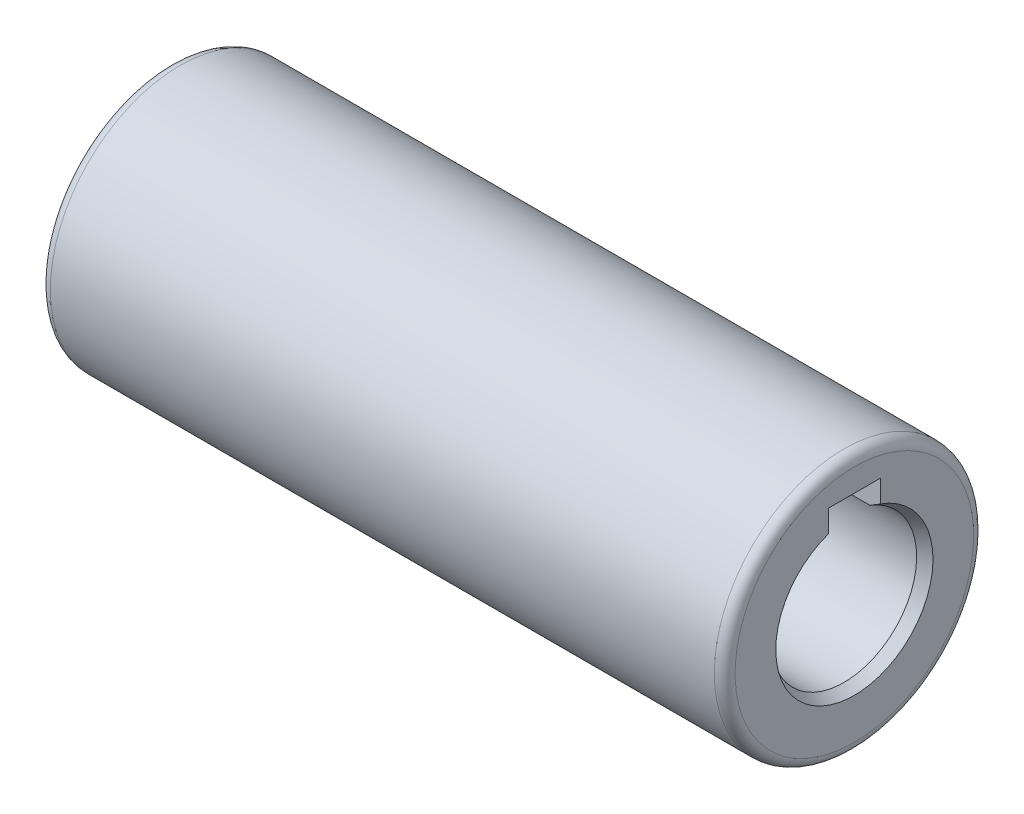
ISO-10303-21;
HEADER;
FILE_DESCRIPTION(('STEP AP214'),'2;1');
FILE_NAME('part.step','',(''),(''),'','','');
FILE_SCHEMA(('AUTOMOTIVE_DESIGN { 1 0 10303 214 1 1 1 1 }'));
ENDSEC;
DATA;
#1=APPLICATION_CONTEXT('core data for automotive mechanical design processes');
#2=APPLICATION_PROTOCOL_DEFINITION('international standard','automotive_design',2000,#1);
#3=PRODUCT_CONTEXT('',#1,'mechanical');
#4=PRODUCT('Part','Part','',(#3));
#5=PRODUCT_RELATED_PRODUCT_CATEGORY('part','',(#4));
#6=PRODUCT_DEFINITION_FORMATION('','',#4);
#7=PRODUCT_DEFINITION_CONTEXT('part definition',#1,'design');
#8=PRODUCT_DEFINITION('design','',#6,#7);
#9=PRODUCT_DEFINITION_SHAPE('','',#8);
#10=(LENGTH_UNIT() NAMED_UNIT(*) SI_UNIT(.MILLI.,.METRE.));
#11=(NAMED_UNIT(*) PLANE_ANGLE_UNIT() SI_UNIT($,.RADIAN.));
#12=(NAMED_UNIT(*) SI_UNIT($,.STERADIAN.) SOLID_ANGLE_UNIT());
#13=UNCERTAINTY_MEASURE_WITH_UNIT(LENGTH_MEASURE(1.E-05),#10,'distance_accuracy_value','');
#14=(GEOMETRIC_REPRESENTATION_CONTEXT(3) GLOBAL_UNCERTAINTY_ASSIGNED_CONTEXT((#13)) GLOBAL_UNIT_ASSIGNED_CONTEXT((#10,
#11,#12)) REPRESENTATION_CONTEXT('',''));
#15=CARTESIAN_POINT('',(0.,0.,0.));
#16=DIRECTION('',(0.,0.,1.));
#17=DIRECTION('',(1.,0.,0.));
#18=AXIS2_PLACEMENT_3D('',#15,#16,#17);
#19=CARTESIAN_POINT('',(-33.,0.,0.));
#20=DIRECTION('',(-1.,0.,0.));
#21=DIRECTION('',(0.,-1.,0.));
#22=AXIS2_PLACEMENT_3D('',#19,#20,#21);
#23=CYLINDRICAL_SURFACE('',#22,7.);
#24=CARTESIAN_POINT('',(7.5,0.,0.));
#25=DIRECTION('',(-1.,0.,0.));
#26=DIRECTION('',(0.,-1.,0.));
#27=AXIS2_PLACEMENT_3D('',#24,#25,#26);
#28=CIRCLE('',#27,7.);
#29=CARTESIAN_POINT('',(7.5,6.53834841531101,-2.5));
#30=VERTEX_POINT('',#29);
#31=CARTESIAN_POINT('',(7.5,6.53834841531101,2.5));
#32=VERTEX_POINT('',#31);
#33=EDGE_CURVE('E224',#30,#32,#28,.T.);
#34=ORIENTED_EDGE('',*,*,#33,.T.);
#35=DIRECTION('',(-1.,0.,0.));
#36=VECTOR('',#35,1.);
#37=CARTESIAN_POINT('',(-33.,6.53834841531101,2.5));
#38=LINE('',#37,#36);
#39=CARTESIAN_POINT('',(32.,6.53834841531102,2.5));
#40=VERTEX_POINT('',#39);
#41=EDGE_CURVE('E178',#32,#40,#38,.F.);
#42=ORIENTED_EDGE('',*,*,#41,.T.);
#43=CARTESIAN_POINT('',(32.,0.,0.));
#44=DIRECTION('',(-1.,0.,0.));
#45=DIRECTION('',(0.,-1.,0.));
#46=AXIS2_PLACEMENT_3D('',#43,#44,#45);
#47=CIRCLE('',#46,7.);
#48=CARTESIAN_POINT('',(32.,6.53834841531102,-2.5));
#49=VERTEX_POINT('',#48);
#50=EDGE_CURVE('E245',#40,#49,#47,.F.);
#51=ORIENTED_EDGE('',*,*,#50,.T.);
#52=DIRECTION('',(-1.,0.,0.));
#53=VECTOR('',#52,1.);
#54=CARTESIAN_POINT('',(-33.,6.53834841531101,-2.5));
#55=LINE('',#54,#53);
#56=EDGE_CURVE('E46',#49,#30,#55,.T.);
#57=ORIENTED_EDGE('',*,*,#56,.T.);
#58=EDGE_LOOP('',(#34,#42,#51,#57));
#59=FACE_BOUND('',#58,.T.);
#60=ADVANCED_FACE('F17',(#59),#23,.F.);
#61=CARTESIAN_POINT('',(4.,0.,0.));
#62=DIRECTION('',(-1.,0.,0.));
#63=DIRECTION('',(0.,-1.,0.));
#64=AXIS2_PLACEMENT_3D('',#61,#62,#63);
#65=CONICAL_SURFACE('',#64,10.5,0.785398163397448);
#66=CARTESIAN_POINT('',(3.46163000243048,9.3,-5.94605854354318));
#67=CARTESIAN_POINT('',(3.54685120634403,9.3,-5.78783362329451));
#68=CARTESIAN_POINT('',(3.63022221766871,9.30000000000001,-5.62859718548707));
#69=CARTESIAN_POINT('',(3.7927083936606,9.30000000000001,-5.30803499150762));
#70=CARTESIAN_POINT('',(3.87182492851184,9.30000000000001,-5.14670992901251));
#71=CARTESIAN_POINT('',(4.02558275946007,9.30000000000001,-4.82120873302001));
#72=CARTESIAN_POINT('',(4.10020666279463,9.30000000000001,-4.65702434100527));
#73=CARTESIAN_POINT('',(4.24407597855057,9.30000000000001,-4.326218926683));
#74=CARTESIAN_POINT('',(4.31331851061846,9.30000000000001,-4.1595966554366));
#75=CARTESIAN_POINT('',(4.51321496536946,9.30000000000001,-3.65279891292511));
#76=CARTESIAN_POINT('',(4.63452110300595,9.30000000000001,-3.30884355687202));
#77=CARTESIAN_POINT('',(4.84597044842199,9.3,-2.61156273327106));
#78=CARTESIAN_POINT('',(4.93613791014679,9.3,-2.25824479028153));
#79=CARTESIAN_POINT('',(5.05397250067452,9.3,-1.66998525222829));
#80=CARTESIAN_POINT('',(5.09246729373263,9.3,-1.43719717309367));
#81=CARTESIAN_POINT('',(5.15248858293873,9.30000000000001,-0.969393789805004));
#82=CARTESIAN_POINT('',(5.17401420484636,9.30000000000001,-0.734378371531098));
#83=CARTESIAN_POINT('',(5.19915444556598,9.30000000000001,-0.265045907994946));
#84=CARTESIAN_POINT('',(5.202894275992,9.30000000000001,-0.0307356213817093));
#85=CARTESIAN_POINT('',(5.19265855297041,9.3,0.437496657778366));
#86=CARTESIAN_POINT('',(5.17868249325451,9.3,0.671418639037289));
#87=CARTESIAN_POINT('',(5.13040380997504,9.3,1.17012886665844));
#88=CARTESIAN_POINT('',(5.09353656300503,9.3,1.4346685867482));
#89=CARTESIAN_POINT('',(4.99920645475335,9.30000000000001,1.96008716742081));
#90=CARTESIAN_POINT('',(4.94173800486261,9.30000000000001,2.22096501465124));
#91=CARTESIAN_POINT('',(4.84147591244329,9.30000000000001,2.61018773385523));
#92=CARTESIAN_POINT('',(4.80546128972083,9.30000000000001,2.74032840084046));
#93=CARTESIAN_POINT('',(4.72910092706749,9.30000000000001,2.99929424331557));
#94=CARTESIAN_POINT('',(4.68875643198022,9.30000000000001,3.12811978530305));
#95=CARTESIAN_POINT('',(4.56171406657002,9.3,3.51255281376575));
#96=CARTESIAN_POINT('',(4.46899120980495,9.3,3.76617809687951));
#97=CARTESIAN_POINT('',(4.2226115131823,9.3,4.38754109106529));
#98=CARTESIAN_POINT('',(4.06096701828225,9.3,4.75209298387828));
#99=CARTESIAN_POINT('',(3.71501728910871,9.30000000000001,5.47037453660907));
#100=CARTESIAN_POINT('',(3.53069828568788,9.30000000000001,5.8240974561831));
#101=CARTESIAN_POINT('',(3.1440431200673,9.30000000000001,6.52325741646248));
#102=CARTESIAN_POINT('',(2.94164024728258,9.30000000000001,6.8686572626618));
#103=CARTESIAN_POINT('',(2.52349168194028,9.30000000000001,7.55112134634234));
#104=CARTESIAN_POINT('',(2.30774889633075,9.30000000000001,7.88818737762043));
#105=CARTESIAN_POINT('',(1.87732784217865,9.30000000000001,8.53802918293863));
#106=CARTESIAN_POINT('',(1.66317768157205,9.30000000000001,8.85115657629117));
#107=CARTESIAN_POINT('',(1.22736195761923,9.30000000000001,9.47215972682581));
#108=CARTESIAN_POINT('',(1.00569576703578,9.30000000000001,9.78003504246624));
#109=CARTESIAN_POINT('',(0.55836922060326,9.30000000000001,10.3885180025935));
#110=CARTESIAN_POINT('',(0.332764110091508,9.30000000000001,10.6891663985368));
#111=CARTESIAN_POINT('',(-0.123311726676725,9.30000000000001,11.2866301151147));
#112=CARTESIAN_POINT('',(-0.353781172022986,9.3,11.5834464124671));
#113=CARTESIAN_POINT('',(-0.586202909211337,9.3,11.8787001905889));
#114=B_SPLINE_CURVE_WITH_KNOTS('',3,(#66,#67,#68,#69,#70,#71,#72,#73,#74,#75,#76,#77,#78,#79,
#80,#81,#82,#83,#84,#85,#86,#87,#88,#89,#90,#91,#92,#93,#94,#95,#96,#97,#98,#99,#100,#101,#102,
#103,#104,#105,#106,#107,#108,#109,#110,#111,#112,#113),.UNSPECIFIED.,.F.,.F.,(4,2,2,2,2,2,2,2,
2,2,2,2,2,2,2,2,2,2,2,2,2,2,2,4),(0.,0.539153897346478,1.0781331034826,1.61908002222792,
2.16031451421384,3.2532519204881,4.34533610648292,5.05263433922266,5.75996900911444,
6.46231661126947,7.16468428491629,7.96507694739988,8.76568690160594,9.17071941196027,
9.5756357853459,10.3852784874463,11.5805521499964,12.7765552617353,13.9771685047727,
15.177521033697,16.3154499334511,17.4534740319536,18.5810653901236,19.708363438943),.UNSPECIFIED.);
#115=CARTESIAN_POINT('',(4.86983904599721,9.3,-2.5));
#116=VERTEX_POINT('',#115);
#117=CARTESIAN_POINT('',(4.86983904599721,9.3,2.5));
#118=VERTEX_POINT('',#117);
#119=EDGE_CURVE('E208',#116,#118,#114,.T.);
#120=ORIENTED_EDGE('',*,*,#119,.T.);
#121=CARTESIAN_POINT('',(1.39485028369227,12.8644840194561,2.5));
#122=CARTESIAN_POINT('',(1.64194981924903,12.6127582938976,2.5));
#123=CARTESIAN_POINT('',(1.88891869151697,12.360904211294,2.5));
#124=CARTESIAN_POINT('',(2.38253410736025,11.8568794750453,2.5));
#125=CARTESIAN_POINT('',(2.629180650331,11.6047088208082,2.5));
#126=CARTESIAN_POINT('',(3.36856629729448,10.8476106897931,2.5));
#127=CARTESIAN_POINT('',(3.86072894606619,10.3421199165439,2.5));
#128=CARTESIAN_POINT('',(4.84255203455589,9.32909770687162,2.5));
#129=CARTESIAN_POINT('',(5.33221338876389,8.82156715873817,2.5));
#130=CARTESIAN_POINT('',(6.06384909279959,8.05753833431255,2.5));
#131=CARTESIAN_POINT('',(6.30725074351754,7.80240747366521,2.5));
#132=CARTESIAN_POINT('',(6.79277961095316,7.29093658021132,2.5));
#133=CARTESIAN_POINT('',(7.03490683296757,7.03459655243869,2.5));
#134=CARTESIAN_POINT('',(7.47674185788069,6.56365896249445,2.5));
#135=CARTESIAN_POINT('',(7.67671700603354,6.34931246279199,2.5));
#136=CARTESIAN_POINT('',(8.07506980507555,5.91914924601433,2.5));
#137=CARTESIAN_POINT('',(8.27344749866287,5.70333256852188,2.5));
#138=CARTESIAN_POINT('',(8.66806681613347,5.26968329002073,2.5));
#139=CARTESIAN_POINT('',(8.86430807976641,5.05185036014247,2.5));
#140=CARTESIAN_POINT('',(9.1563594487669,4.72303074981693,2.5));
#141=CARTESIAN_POINT('',(9.25332894260962,4.61307439840474,2.5));
#142=CARTESIAN_POINT('',(9.44631845902583,4.39232751658852,2.5));
#143=CARTESIAN_POINT('',(9.54233845943368,4.28153696681624,2.5));
#144=CARTESIAN_POINT('',(9.63779326443298,4.1702583060757,2.5));
#145=B_SPLINE_CURVE_WITH_KNOTS('',3,(#121,#122,#123,#124,#125,#126,#127,#128,#129,#130,#131,
#132,#133,#134,#135,#136,#137,#138,#139,#140,#141,#142,#143,#144),.UNSPECIFIED.,.F.,.F.,(4,2,2,
2,2,2,2,2,2,2,2,4),(0.,1.0582137102719,2.11642940258514,4.23295698204211,6.34864562076016,
7.40648239678765,8.46431477277966,9.3437461932028,10.2231540288632,11.1027079246151,
11.5425227463704,11.9823478113402),.UNSPECIFIED.);
#146=EDGE_CURVE('E264',#118,#32,#145,.T.);
#147=ORIENTED_EDGE('',*,*,#146,.T.);
#148=ORIENTED_EDGE('',*,*,#33,.F.);
#149=CARTESIAN_POINT('',(9.63779326443298,4.1702583060757,-2.5));
#150=CARTESIAN_POINT('',(9.54233845943368,4.28153696681624,-2.5));
#151=CARTESIAN_POINT('',(9.44631845902583,4.39232751658852,-2.5));
#152=CARTESIAN_POINT('',(9.25332894260962,4.61307439840474,-2.5));
#153=CARTESIAN_POINT('',(9.1563594487669,4.72303074981693,-2.5));
#154=CARTESIAN_POINT('',(8.86430807976641,5.05185036014246,-2.5));
#155=CARTESIAN_POINT('',(8.66806681613348,5.26968329002073,-2.5));
#156=CARTESIAN_POINT('',(8.27344749866287,5.70333256852187,-2.5));
#157=CARTESIAN_POINT('',(8.07506980507555,5.91914924601433,-2.5));
#158=CARTESIAN_POINT('',(7.67671700603355,6.34931246279198,-2.5));
#159=CARTESIAN_POINT('',(7.4767418578807,6.56365896249445,-2.5));
#160=CARTESIAN_POINT('',(7.03490683296758,7.03459655243869,-2.5));
#161=CARTESIAN_POINT('',(6.79277961095316,7.29093658021132,-2.5));
#162=CARTESIAN_POINT('',(6.30725074351755,7.80240747366521,-2.5));
#163=CARTESIAN_POINT('',(6.06384909279959,8.05753833431255,-2.5));
#164=CARTESIAN_POINT('',(5.3322133887639,8.82156715873816,-2.5));
#165=CARTESIAN_POINT('',(4.84255203455589,9.32909770687162,-2.5));
#166=CARTESIAN_POINT('',(3.86072894606619,10.3421199165439,-2.5));
#167=CARTESIAN_POINT('',(3.36856629729449,10.8476106897931,-2.5));
#168=CARTESIAN_POINT('',(2.629180650331,11.6047088208082,-2.5));
#169=CARTESIAN_POINT('',(2.38253410736025,11.8568794750453,-2.5));
#170=CARTESIAN_POINT('',(1.88891869151697,12.360904211294,-2.5));
#171=CARTESIAN_POINT('',(1.64194981924903,12.6127582938976,-2.5));
#172=CARTESIAN_POINT('',(1.39485028369227,12.8644840194561,-2.5));
#173=B_SPLINE_CURVE_WITH_KNOTS('',3,(#149,#150,#151,#152,#153,#154,#155,#156,#157,#158,#159,
#160,#161,#162,#163,#164,#165,#166,#167,#168,#169,#170,#171,#172),.UNSPECIFIED.,.F.,.F.,(4,2,2,
2,2,2,2,2,2,2,2,4),(0.,0.439825064969736,0.879639886725099,1.75919378247692,2.63860161813736,
3.5180330385605,4.57586541455251,5.63370219058,7.74939082929805,9.86591840875502,
10.9241341010683,11.9823478113402),.UNSPECIFIED.);
#174=EDGE_CURVE('E135',#30,#116,#173,.T.);
#175=ORIENTED_EDGE('',*,*,#174,.T.);
#176=EDGE_LOOP('',(#120,#147,#148,#175));
#177=FACE_BOUND('',#176,.T.);
#178=CARTESIAN_POINT('',(4.,0.,0.));
#179=DIRECTION('',(-1.,0.,0.));
#180=DIRECTION('',(0.,-1.,0.));
#181=AXIS2_PLACEMENT_3D('',#178,#179,#180);
#182=CIRCLE('',#181,10.5);
#183=CARTESIAN_POINT('',(4.,-10.5,0.));
#184=VERTEX_POINT('',#183);
#185=EDGE_CURVE('E221',#184,#184,#182,.T.);
#186=ORIENTED_EDGE('',*,*,#185,.T.);
#187=EDGE_LOOP('',(#186));
#188=FACE_BOUND('',#187,.T.);
#189=ADVANCED_FACE('F150',(#177,#188),#65,.F.);
#190=CARTESIAN_POINT('',(-33.,0.,0.));
#191=DIRECTION('',(-1.,0.,0.));
#192=DIRECTION('',(0.,-1.,0.));
#193=AXIS2_PLACEMENT_3D('',#190,#191,#192);
#194=CYLINDRICAL_SURFACE('',#193,10.5);
#195=ORIENTED_EDGE('',*,*,#185,.F.);
#196=EDGE_LOOP('',(#195));
#197=FACE_BOUND('',#196,.T.);
#198=CARTESIAN_POINT('',(-4.,0.,0.));
#199=DIRECTION('',(-1.,0.,0.));
#200=DIRECTION('',(0.,-1.,0.));
#201=AXIS2_PLACEMENT_3D('',#198,#199,#200);
#202=CIRCLE('',#201,10.5);
#203=CARTESIAN_POINT('',(-4.,-10.5,0.));
#204=VERTEX_POINT('',#203);
#205=EDGE_CURVE('E218',#204,#204,#202,.T.);
#206=ORIENTED_EDGE('',*,*,#205,.T.);
#207=EDGE_LOOP('',(#206));
#208=FACE_BOUND('',#207,.T.);
#209=ADVANCED_FACE('F186',(#197,#208),#194,.F.);
#210=CARTESIAN_POINT('',(-7.5,0.,0.));
#211=DIRECTION('',(1.,0.,0.));
#212=DIRECTION('',(0.,1.,0.));
#213=AXIS2_PLACEMENT_3D('',#210,#211,#212);
#214=CONICAL_SURFACE('',#213,7.,0.785398163397448);
#215=ORIENTED_EDGE('',*,*,#205,.F.);
#216=EDGE_LOOP('',(#215));
#217=FACE_BOUND('',#216,.T.);
#218=CARTESIAN_POINT('',(-7.5,0.,0.));
#219=DIRECTION('',(-1.,0.,0.));
#220=DIRECTION('',(0.,-1.,0.));
#221=AXIS2_PLACEMENT_3D('',#218,#219,#220);
#222=CIRCLE('',#221,7.);
#223=CARTESIAN_POINT('',(-7.5,6.53834841531101,-2.5));
#224=VERTEX_POINT('',#223);
#225=CARTESIAN_POINT('',(-7.5,6.53834841531101,2.5));
#226=VERTEX_POINT('',#225);
#227=EDGE_CURVE('E215',#224,#226,#222,.T.);
#228=ORIENTED_EDGE('',*,*,#227,.T.);
#229=CARTESIAN_POINT('',(-9.63779326443298,4.1702583060757,2.5));
#230=CARTESIAN_POINT('',(-9.54233845943368,4.28153696681623,2.5));
#231=CARTESIAN_POINT('',(-9.44631845902583,4.39232751658851,2.5));
#232=CARTESIAN_POINT('',(-9.25332894260962,4.61307439840473,2.5));
#233=CARTESIAN_POINT('',(-9.15635944876689,4.72303074981692,2.5));
#234=CARTESIAN_POINT('',(-8.8643080797664,5.05185036014246,2.5));
#235=CARTESIAN_POINT('',(-8.66806681613347,5.26968329002072,2.5));
#236=CARTESIAN_POINT('',(-8.27344749866287,5.70333256852187,2.5));
#237=CARTESIAN_POINT('',(-8.07506980507554,5.91914924601433,2.5));
#238=CARTESIAN_POINT('',(-7.67671700603354,6.34931246279199,2.5));
#239=CARTESIAN_POINT('',(-7.47674185788069,6.56365896249445,2.5));
#240=CARTESIAN_POINT('',(-7.03490683296757,7.03459655243869,2.5));
#241=CARTESIAN_POINT('',(-6.79277961095315,7.29093658021132,2.5));
#242=CARTESIAN_POINT('',(-6.30725074351754,7.80240747366521,2.5));
#243=CARTESIAN_POINT('',(-6.06384909279958,8.05753833431255,2.5));
#244=CARTESIAN_POINT('',(-5.33221338876389,8.82156715873817,2.5));
#245=CARTESIAN_POINT('',(-4.84255203455588,9.32909770687163,2.5));
#246=CARTESIAN_POINT('',(-3.86072894606618,10.3421199165439,2.5));
#247=CARTESIAN_POINT('',(-3.36856629729447,10.8476106897931,2.5));
#248=CARTESIAN_POINT('',(-2.62918065033099,11.6047088208082,2.5));
#249=CARTESIAN_POINT('',(-2.38253410736024,11.8568794750454,2.5));
#250=CARTESIAN_POINT('',(-1.88891869151696,12.360904211294,2.5));
#251=CARTESIAN_POINT('',(-1.64194981924902,12.6127582938977,2.5));
#252=CARTESIAN_POINT('',(-1.39485028369226,12.8644840194561,2.5));
#253=B_SPLINE_CURVE_WITH_KNOTS('',3,(#229,#230,#231,#232,#233,#234,#235,#236,#237,#238,#239,
#240,#241,#242,#243,#244,#245,#246,#247,#248,#249,#250,#251,#252),.UNSPECIFIED.,.F.,.F.,(4,2,2,
2,2,2,2,2,2,2,2,4),(0.,0.439825064969736,0.879639886725099,1.75919378247692,2.63860161813736,
3.51803303856051,4.57586541455252,5.63370219058001,7.74939082929807,9.86591840875504,
10.9241341010683,11.9823478113402),.UNSPECIFIED.);
#254=CARTESIAN_POINT('',(-4.86983904599721,9.3,2.5));
#255=VERTEX_POINT('',#254);
#256=EDGE_CURVE('E193',#226,#255,#253,.T.);
#257=ORIENTED_EDGE('',*,*,#256,.T.);
#258=CARTESIAN_POINT('',(-3.46163000243048,9.3,-5.94605854354319));
#259=CARTESIAN_POINT('',(-3.54685120634403,9.3,-5.78783362329452));
#260=CARTESIAN_POINT('',(-3.63022221766871,9.3,-5.62859718548708));
#261=CARTESIAN_POINT('',(-3.79270839366059,9.3,-5.30803499150763));
#262=CARTESIAN_POINT('',(-3.87182492851184,9.3,-5.14670992901251));
#263=CARTESIAN_POINT('',(-4.02558275946007,9.3,-4.82120873302002));
#264=CARTESIAN_POINT('',(-4.10020666279463,9.3,-4.65702434100527));
#265=CARTESIAN_POINT('',(-4.24407597855056,9.3,-4.32621892668301));
#266=CARTESIAN_POINT('',(-4.31331851061846,9.3,-4.1595966554366));
#267=CARTESIAN_POINT('',(-4.51321496536946,9.3,-3.65279891292511));
#268=CARTESIAN_POINT('',(-4.63452110300594,9.30000000000001,-3.30884355687202));
#269=CARTESIAN_POINT('',(-4.84597044842198,9.3,-2.61156273327106));
#270=CARTESIAN_POINT('',(-4.93613791014679,9.3,-2.25824479028153));
#271=CARTESIAN_POINT('',(-5.05397250067452,9.3,-1.66998525222829));
#272=CARTESIAN_POINT('',(-5.09246729373263,9.3,-1.43719717309367));
#273=CARTESIAN_POINT('',(-5.15248858293873,9.30000000000001,-0.969393789805005));
#274=CARTESIAN_POINT('',(-5.17401420484635,9.3,-0.734378371531098));
#275=CARTESIAN_POINT('',(-5.19915444556598,9.3,-0.265045907994947));
#276=CARTESIAN_POINT('',(-5.202894275992,9.30000000000001,-0.0307356213817101));
#277=CARTESIAN_POINT('',(-5.19265855297041,9.3,0.437496657778366));
#278=CARTESIAN_POINT('',(-5.17868249325451,9.3,0.671418639037288));
#279=CARTESIAN_POINT('',(-5.13040380997504,9.3,1.17012886665844));
#280=CARTESIAN_POINT('',(-5.09353656300503,9.3,1.4346685867482));
#281=CARTESIAN_POINT('',(-4.99920645475335,9.30000000000001,1.96008716742081));
#282=CARTESIAN_POINT('',(-4.94173800486261,9.3,2.22096501465124));
#283=CARTESIAN_POINT('',(-4.84147591244329,9.3,2.61018773385523));
#284=CARTESIAN_POINT('',(-4.80546128972083,9.3,2.74032840084046));
#285=CARTESIAN_POINT('',(-4.72910092706749,9.3,2.99929424331557));
#286=CARTESIAN_POINT('',(-4.68875643198021,9.3,3.12811978530305));
#287=CARTESIAN_POINT('',(-4.56171406657002,9.3,3.51255281376575));
#288=CARTESIAN_POINT('',(-4.46899120980495,9.3,3.76617809687951));
#289=CARTESIAN_POINT('',(-4.22261151318231,9.3,4.38754109106529));
#290=CARTESIAN_POINT('',(-4.06096701828225,9.3,4.75209298387827));
#291=CARTESIAN_POINT('',(-3.71501728910871,9.30000000000001,5.47037453660906));
#292=CARTESIAN_POINT('',(-3.53069828568788,9.3,5.82409745618309));
#293=CARTESIAN_POINT('',(-3.14404312006731,9.3,6.52325741646247));
#294=CARTESIAN_POINT('',(-2.94164024728258,9.3,6.86865726266178));
#295=CARTESIAN_POINT('',(-2.52349168194029,9.3,7.55112134634232));
#296=CARTESIAN_POINT('',(-2.30774889633076,9.3,7.88818737762041));
#297=CARTESIAN_POINT('',(-1.87732784217866,9.3,8.53802918293861));
#298=CARTESIAN_POINT('',(-1.66317768157206,9.3,8.85115657629115));
#299=CARTESIAN_POINT('',(-1.22736195761925,9.3,9.47215972682579));
#300=CARTESIAN_POINT('',(-1.0056957670358,9.3,9.78003504246622));
#301=CARTESIAN_POINT('',(-0.558369220603279,9.3,10.3885180025935));
#302=CARTESIAN_POINT('',(-0.332764110091528,9.3,10.6891663985368));
#303=CARTESIAN_POINT('',(0.123311726676705,9.3,11.2866301151146));
#304=CARTESIAN_POINT('',(0.353781172022967,9.3,11.583446412467));
#305=CARTESIAN_POINT('',(0.586202909211323,9.3,11.8787001905889));
#306=B_SPLINE_CURVE_WITH_KNOTS('',3,(#258,#259,#260,#261,#262,#263,#264,#265,#266,#267,#268,
#269,#270,#271,#272,#273,#274,#275,#276,#277,#278,#279,#280,#281,#282,#283,#284,#285,#286,#287,
#288,#289,#290,#291,#292,#293,#294,#295,#296,#297,#298,#299,#300,#301,#302,#303,#304,#305),
.UNSPECIFIED.,.F.,.F.,(4,2,2,2,2,2,2,2,2,2,2,2,2,2,2,2,2,2,2,2,2,2,2,4),(0.,0.539153897346479,
1.0781331034826,1.61908002222792,2.16031451421384,3.25325192048811,4.34533610648293,
5.05263433922267,5.75996900911445,6.46231661126948,7.1646842849163,7.9650769473999,
8.76568690160595,9.17071941196028,9.57563578534592,10.3852784874463,11.5805521499964,
12.7765552617353,13.9771685047727,15.177521033697,16.3154499334511,17.4534740319536,
18.5810653901236,19.708363438943),.UNSPECIFIED.);
#307=CARTESIAN_POINT('',(-4.86983904599721,9.3,-2.5));
#308=VERTEX_POINT('',#307);
#309=EDGE_CURVE('E200',#255,#308,#306,.F.);
#310=ORIENTED_EDGE('',*,*,#309,.T.);
#311=CARTESIAN_POINT('',(-1.39485028369226,12.8644840194561,-2.5));
#312=CARTESIAN_POINT('',(-1.64194981924902,12.6127582938977,-2.5));
#313=CARTESIAN_POINT('',(-1.88891869151696,12.360904211294,-2.5));
#314=CARTESIAN_POINT('',(-2.38253410736024,11.8568794750454,-2.5));
#315=CARTESIAN_POINT('',(-2.62918065033099,11.6047088208082,-2.5));
#316=CARTESIAN_POINT('',(-3.36856629729447,10.8476106897931,-2.5));
#317=CARTESIAN_POINT('',(-3.86072894606617,10.3421199165439,-2.5));
#318=CARTESIAN_POINT('',(-4.84255203455588,9.32909770687163,-2.5));
#319=CARTESIAN_POINT('',(-5.33221338876388,8.82156715873817,-2.5));
#320=CARTESIAN_POINT('',(-6.06384909279958,8.05753833431255,-2.5));
#321=CARTESIAN_POINT('',(-6.30725074351753,7.80240747366521,-2.5));
#322=CARTESIAN_POINT('',(-6.79277961095315,7.29093658021133,-2.5));
#323=CARTESIAN_POINT('',(-7.03490683296757,7.03459655243871,-2.5));
#324=CARTESIAN_POINT('',(-7.47674185788069,6.56365896249446,-2.5));
#325=CARTESIAN_POINT('',(-7.67671700603354,6.34931246279199,-2.5));
#326=CARTESIAN_POINT('',(-8.07506980507554,5.91914924601433,-2.5));
#327=CARTESIAN_POINT('',(-8.27344749866286,5.70333256852187,-2.5));
#328=CARTESIAN_POINT('',(-8.66806681613347,5.26968329002073,-2.5));
#329=CARTESIAN_POINT('',(-8.8643080797664,5.05185036014246,-2.5));
#330=CARTESIAN_POINT('',(-9.15635944876689,4.72303074981692,-2.5));
#331=CARTESIAN_POINT('',(-9.25332894260962,4.61307439840473,-2.5));
#332=CARTESIAN_POINT('',(-9.44631845902583,4.39232751658851,-2.5));
#333=CARTESIAN_POINT('',(-9.54233845943368,4.28153696681623,-2.5));
#334=CARTESIAN_POINT('',(-9.63779326443298,4.1702583060757,-2.5));
#335=B_SPLINE_CURVE_WITH_KNOTS('',3,(#311,#312,#313,#314,#315,#316,#317,#318,#319,#320,#321,
#322,#323,#324,#325,#326,#327,#328,#329,#330,#331,#332,#333,#334),.UNSPECIFIED.,.F.,.F.,(4,2,2,
2,2,2,2,2,2,2,2,4),(0.,1.0582137102719,2.11642940258515,4.23295698204211,6.34864562076017,
7.40648239678766,8.46431477277967,9.34374619320282,10.2231540288633,11.1027079246151,
11.5425227463704,11.9823478113402),.UNSPECIFIED.);
#336=EDGE_CURVE('E101',#308,#224,#335,.T.);
#337=ORIENTED_EDGE('',*,*,#336,.T.);
#338=EDGE_LOOP('',(#228,#257,#310,#337));
#339=FACE_BOUND('',#338,.T.);
#340=ADVANCED_FACE('F181',(#217,#339),#214,.F.);
#341=CARTESIAN_POINT('',(-33.,0.,0.));
#342=DIRECTION('',(-1.,0.,0.));
#343=DIRECTION('',(0.,-1.,0.));
#344=AXIS2_PLACEMENT_3D('',#341,#342,#343);
#345=CYLINDRICAL_SURFACE('',#344,7.);
#346=CARTESIAN_POINT('',(-32.4226497308103,0.,0.));
#347=DIRECTION('',(1.,0.,0.));
#348=DIRECTION('',(0.,1.,0.));
#349=AXIS2_PLACEMENT_3D('',#346,#347,#348);
#350=CIRCLE('',#349,7.);
#351=CARTESIAN_POINT('',(-32.4226497308103,6.53834841531101,-2.5));
#352=VERTEX_POINT('',#351);
#353=CARTESIAN_POINT('',(-32.4226497308103,6.53834841531101,2.5));
#354=VERTEX_POINT('',#353);
#355=EDGE_CURVE('E239',#352,#354,#350,.F.);
#356=ORIENTED_EDGE('',*,*,#355,.T.);
#357=DIRECTION('',(-1.,0.,0.));
#358=VECTOR('',#357,1.);
#359=CARTESIAN_POINT('',(-33.,6.53834841531101,2.5));
#360=LINE('',#359,#358);
#361=EDGE_CURVE('E201',#354,#226,#360,.F.);
#362=ORIENTED_EDGE('',*,*,#361,.T.);
#363=ORIENTED_EDGE('',*,*,#227,.F.);
#364=DIRECTION('',(-1.,0.,0.));
#365=VECTOR('',#364,1.);
#366=CARTESIAN_POINT('',(-33.,6.53834841531101,-2.5));
#367=LINE('',#366,#365);
#368=EDGE_CURVE('E179',#224,#352,#367,.T.);
#369=ORIENTED_EDGE('',*,*,#368,.T.);
#370=EDGE_LOOP('',(#356,#362,#363,#369));
#371=FACE_BOUND('',#370,.T.);
#372=ADVANCED_FACE('F185',(#371),#345,.F.);
#373=CARTESIAN_POINT('',(-33.,7.,0.));
#374=DIRECTION('',(1.,0.,0.));
#375=DIRECTION('',(0.,1.,0.));
#376=AXIS2_PLACEMENT_3D('',#373,#374,#375);
#377=PLANE('',#376);
#378=DIRECTION('',(0.,0.,1.));
#379=VECTOR('',#378,1.);
#380=CARTESIAN_POINT('',(-33.,9.3,2.5));
#381=LINE('',#380,#379);
#382=CARTESIAN_POINT('',(-33.,9.3,-2.5));
#383=VERTEX_POINT('',#382);
#384=CARTESIAN_POINT('',(-33.,9.3,2.5));
#385=VERTEX_POINT('',#384);
#386=EDGE_CURVE('E108',#383,#385,#381,.T.);
#387=ORIENTED_EDGE('',*,*,#386,.T.);
#388=DIRECTION('',(0.,-1.,0.));
#389=VECTOR('',#388,1.);
#390=CARTESIAN_POINT('',(-33.,4.29804226654284,2.5));
#391=LINE('',#390,#389);
#392=CARTESIAN_POINT('',(-33.,7.59934207678534,2.5));
#393=VERTEX_POINT('',#392);
#394=EDGE_CURVE('E121',#385,#393,#391,.T.);
#395=ORIENTED_EDGE('',*,*,#394,.T.);
#396=CARTESIAN_POINT('',(-33.,0.,0.));
#397=DIRECTION('',(1.,0.,0.));
#398=DIRECTION('',(0.,1.,0.));
#399=AXIS2_PLACEMENT_3D('',#396,#397,#398);
#400=CIRCLE('',#399,8.);
#401=CARTESIAN_POINT('',(-33.,7.59934207678534,-2.5));
#402=VERTEX_POINT('',#401);
#403=EDGE_CURVE('E120',#393,#402,#400,.T.);
#404=ORIENTED_EDGE('',*,*,#403,.T.);
#405=DIRECTION('',(0.,1.,0.));
#406=VECTOR('',#405,1.);
#407=CARTESIAN_POINT('',(-33.,4.29804226654284,-2.5));
#408=LINE('',#407,#406);
#409=EDGE_CURVE('E38',#402,#383,#408,.T.);
#410=ORIENTED_EDGE('',*,*,#409,.T.);
#411=EDGE_LOOP('',(#387,#395,#404,#410));
#412=FACE_BOUND('',#411,.T.);
#413=CARTESIAN_POINT('',(-33.,0.,0.));
#414=DIRECTION('',(1.,0.,0.));
#415=DIRECTION('',(0.,1.,0.));
#416=AXIS2_PLACEMENT_3D('',#413,#414,#415);
#417=CIRCLE('',#416,11.5);
#418=CARTESIAN_POINT('',(-33.,11.5,0.));
#419=VERTEX_POINT('',#418);
#420=EDGE_CURVE('E236',#419,#419,#417,.F.);
#421=ORIENTED_EDGE('',*,*,#420,.T.);
#422=EDGE_LOOP('',(#421));
#423=FACE_BOUND('',#422,.T.);
#424=ADVANCED_FACE('F117',(#412,#423),#377,.F.);
#425=CARTESIAN_POINT('',(-33.,0.,0.));
#426=DIRECTION('',(-1.,0.,0.));
#427=DIRECTION('',(0.,-1.,0.));
#428=AXIS2_PLACEMENT_3D('',#425,#426,#427);
#429=CYLINDRICAL_SURFACE('',#428,12.5);
#430=CARTESIAN_POINT('',(32.,0.,0.));
#431=DIRECTION('',(-1.,0.,0.));
#432=DIRECTION('',(0.,-1.,0.));
#433=AXIS2_PLACEMENT_3D('',#430,#431,#432);
#434=CIRCLE('',#433,12.5);
#435=CARTESIAN_POINT('',(32.,-12.5,0.));
#436=VERTEX_POINT('',#435);
#437=EDGE_CURVE('E230',#436,#436,#434,.T.);
#438=ORIENTED_EDGE('',*,*,#437,.T.);
#439=EDGE_LOOP('',(#438));
#440=FACE_BOUND('',#439,.T.);
#441=CARTESIAN_POINT('',(-32.,0.,0.));
#442=DIRECTION('',(1.,0.,0.));
#443=DIRECTION('',(0.,1.,0.));
#444=AXIS2_PLACEMENT_3D('',#441,#442,#443);
#445=CIRCLE('',#444,12.5);
#446=CARTESIAN_POINT('',(-32.,12.5,0.));
#447=VERTEX_POINT('',#446);
#448=EDGE_CURVE('E227',#447,#447,#445,.T.);
#449=ORIENTED_EDGE('',*,*,#448,.T.);
#450=EDGE_LOOP('',(#449));
#451=FACE_BOUND('',#450,.T.);
#452=ADVANCED_FACE('F350',(#440,#451),#429,.T.);
#453=CARTESIAN_POINT('',(33.,12.5,0.));
#454=DIRECTION('',(-1.,0.,0.));
#455=DIRECTION('',(0.,-1.,0.));
#456=AXIS2_PLACEMENT_3D('',#453,#454,#455);
#457=PLANE('',#456);
#458=CARTESIAN_POINT('',(33.,0.,0.));
#459=DIRECTION('',(-1.,0.,0.));
#460=DIRECTION('',(0.,-1.,0.));
#461=AXIS2_PLACEMENT_3D('',#458,#459,#460);
#462=CIRCLE('',#461,7.57735026918963);
#463=CARTESIAN_POINT('',(33.,7.15305788470835,-2.5));
#464=VERTEX_POINT('',#463);
#465=CARTESIAN_POINT('',(33.,7.15305788470835,2.5));
#466=VERTEX_POINT('',#465);
#467=EDGE_CURVE('E243',#464,#466,#462,.T.);
#468=ORIENTED_EDGE('',*,*,#467,.T.);
#469=DIRECTION('',(0.,-1.,0.));
#470=VECTOR('',#469,1.);
#471=CARTESIAN_POINT('',(33.,4.29804226654286,2.5));
#472=LINE('',#471,#470);
#473=CARTESIAN_POINT('',(33.,9.3,2.5));
#474=VERTEX_POINT('',#473);
#475=EDGE_CURVE('E126',#474,#466,#472,.T.);
#476=ORIENTED_EDGE('',*,*,#475,.F.);
#477=DIRECTION('',(0.,0.,1.));
#478=VECTOR('',#477,1.);
#479=CARTESIAN_POINT('',(33.,9.3,2.5));
#480=LINE('',#479,#478);
#481=CARTESIAN_POINT('',(33.,9.3,-2.5));
#482=VERTEX_POINT('',#481);
#483=EDGE_CURVE('E123',#482,#474,#480,.T.);
#484=ORIENTED_EDGE('',*,*,#483,.F.);
#485=DIRECTION('',(0.,1.,0.));
#486=VECTOR('',#485,1.);
#487=CARTESIAN_POINT('',(33.,4.29804226654286,-2.5));
#488=LINE('',#487,#486);
#489=EDGE_CURVE('E128',#464,#482,#488,.T.);
#490=ORIENTED_EDGE('',*,*,#489,.F.);
#491=EDGE_LOOP('',(#468,#476,#484,#490));
#492=FACE_BOUND('',#491,.T.);
#493=CARTESIAN_POINT('',(33.,0.,0.));
#494=DIRECTION('',(-1.,0.,0.));
#495=DIRECTION('',(0.,-1.,0.));
#496=AXIS2_PLACEMENT_3D('',#493,#494,#495);
#497=CIRCLE('',#496,11.5);
#498=CARTESIAN_POINT('',(33.,-11.5,0.));
#499=VERTEX_POINT('',#498);
#500=EDGE_CURVE('E233',#499,#499,#497,.F.);
#501=ORIENTED_EDGE('',*,*,#500,.T.);
#502=EDGE_LOOP('',(#501));
#503=FACE_BOUND('',#502,.T.);
#504=ADVANCED_FACE('F256',(#492,#503),#457,.F.);
#505=CARTESIAN_POINT('',(32.,0.,0.));
#506=DIRECTION('',(-1.,0.,0.));
#507=DIRECTION('',(0.,-1.,0.));
#508=AXIS2_PLACEMENT_3D('',#505,#506,#507);
#509=TOROIDAL_SURFACE('',#508,11.5,1.);
#510=ORIENTED_EDGE('',*,*,#500,.F.);
#511=EDGE_LOOP('',(#510));
#512=FACE_BOUND('',#511,.T.);
#513=ORIENTED_EDGE('',*,*,#437,.F.);
#514=EDGE_LOOP('',(#513));
#515=FACE_BOUND('',#514,.T.);
#516=ADVANCED_FACE('F284',(#512,#515),#509,.T.);
#517=CARTESIAN_POINT('',(-32.,0.,0.));
#518=DIRECTION('',(1.,0.,0.));
#519=DIRECTION('',(0.,1.,0.));
#520=AXIS2_PLACEMENT_3D('',#517,#518,#519);
#521=TOROIDAL_SURFACE('',#520,11.5,1.);
#522=ORIENTED_EDGE('',*,*,#448,.F.);
#523=EDGE_LOOP('',(#522));
#524=FACE_BOUND('',#523,.T.);
#525=ORIENTED_EDGE('',*,*,#420,.F.);
#526=EDGE_LOOP('',(#525));
#527=FACE_BOUND('',#526,.T.);
#528=ADVANCED_FACE('F279',(#524,#527),#521,.T.);
#529=CARTESIAN_POINT('',(-32.4226497308103,0.,0.));
#530=DIRECTION('',(-1.,0.,0.));
#531=DIRECTION('',(0.,-1.,0.));
#532=AXIS2_PLACEMENT_3D('',#529,#530,#531);
#533=CONICAL_SURFACE('',#532,7.,1.0471975511966);
#534=CARTESIAN_POINT('',(-30.1094696017015,1.64644155063533,2.5));
#535=CARTESIAN_POINT('',(-30.1298838116799,1.71071818784571,2.5));
#536=CARTESIAN_POINT('',(-30.1510478172364,1.77475144088342,2.5));
#537=CARTESIAN_POINT('',(-30.1946955688046,1.90235911866556,2.5));
#538=CARTESIAN_POINT('',(-30.2171791651202,1.96593359453897,2.5));
#539=CARTESIAN_POINT('',(-30.2863238600166,2.15596933196882,2.5));
#540=CARTESIAN_POINT('',(-30.3346995664029,2.28180689988586,2.5));
#541=CARTESIAN_POINT('',(-30.4348559937876,2.53192249025086,2.5));
#542=CARTESIAN_POINT('',(-30.4866323745484,2.65620226846833,2.5));
#543=CARTESIAN_POINT('',(-30.5928523789102,2.90363350895722,2.5));
#544=CARTESIAN_POINT('',(-30.647296384866,3.02678480646138,2.5));
#545=CARTESIAN_POINT('',(-30.7581420783214,3.27190859167166,2.5));
#546=CARTESIAN_POINT('',(-30.8145397146788,3.39388291832817,2.5));
#547=CARTESIAN_POINT('',(-30.9289622264745,3.63706711466828,2.5));
#548=CARTESIAN_POINT('',(-30.9869871383342,3.758276967167,2.5));
#549=CARTESIAN_POINT('',(-31.1630274133805,4.12104554739875,2.5));
#550=CARTESIAN_POINT('',(-31.2829732145081,4.36166686533962,2.5));
#551=CARTESIAN_POINT('',(-31.4946984877847,4.77898907460603,2.5));
#552=CARTESIAN_POINT('',(-31.5857138563122,4.95608081721736,2.5));
#553=CARTESIAN_POINT('',(-31.7691579917415,5.30950370413362,2.5));
#554=CARTESIAN_POINT('',(-31.8615865857774,5.48583493813413,2.5));
#555=CARTESIAN_POINT('',(-32.0476092762636,5.83804504867834,2.5));
#556=CARTESIAN_POINT('',(-32.1412041741224,6.01392350113962,2.5));
#557=CARTESIAN_POINT('',(-32.3292659634831,6.36522166045892,2.5));
#558=CARTESIAN_POINT('',(-32.4237328872538,6.54064135002995,2.5));
#559=CARTESIAN_POINT('',(-32.6552247383119,6.96847967271628,2.5));
#560=CARTESIAN_POINT('',(-32.792623202397,7.22069610365958,2.5));
#561=CARTESIAN_POINT('',(-33.0684929008196,7.72454191088908,2.5));
#562=CARTESIAN_POINT('',(-33.2069641387031,7.97617128523117,2.5));
#563=CARTESIAN_POINT('',(-33.6235922658436,8.73038792722535,2.5));
#564=CARTESIAN_POINT('',(-33.9029637238975,9.23230399932505,2.5));
#565=CARTESIAN_POINT('',(-34.4630895258922,10.2339387559511,2.5));
#566=CARTESIAN_POINT('',(-34.7438395793876,10.7336598450947,2.5));
#567=CARTESIAN_POINT('',(-35.1659568594505,11.482672874683,2.5));
#568=CARTESIAN_POINT('',(-35.3068260304073,11.7322456684386,2.5));
#569=CARTESIAN_POINT('',(-35.588843715174,12.2312329258529,2.5));
#570=CARTESIAN_POINT('',(-35.72999222859,12.4806473897343,2.5));
#571=CARTESIAN_POINT('',(-35.8712542770217,12.7299974861727,2.5));
#572=B_SPLINE_CURVE_WITH_KNOTS('',3,(#534,#535,#536,#537,#538,#539,#540,#541,#542,#543,#544,
#545,#546,#547,#548,#549,#550,#551,#552,#553,#554,#555,#556,#557,#558,#559,#560,#561,#562,#563,
#564,#565,#566,#567,#568,#569,#570,#571),.UNSPECIFIED.,.F.,.F.,(4,2,2,2,2,2,2,2,2,2,2,2,2,2,2,2,
2,2,4),(0.,0.202309304563566,0.404595703093765,0.808966851003979,1.21283157368071,
1.61675435320326,2.01988452612486,2.423023729072,3.22955439683132,3.82688301242132,
4.42413913819378,5.02183117221083,5.61954541284425,6.48118144958815,7.34282033571259,
9.06609713301147,10.7856516681071,11.6454051476668,12.5051574155136),.UNSPECIFIED.);
#573=EDGE_CURVE('E265',#354,#393,#572,.T.);
#574=ORIENTED_EDGE('',*,*,#573,.F.);
#575=ORIENTED_EDGE('',*,*,#355,.F.);
#576=CARTESIAN_POINT('',(-35.8712542770217,12.7299974861727,-2.5));
#577=CARTESIAN_POINT('',(-35.7297367202112,12.4801963762895,-2.5));
#578=CARTESIAN_POINT('',(-35.5883331102024,12.2303306666355,-2.5));
#579=CARTESIAN_POINT('',(-35.305806503862,11.7304405804371,-2.5));
#580=CARTESIAN_POINT('',(-35.1646835076013,11.4804162038525,-2.5));
#581=CARTESIAN_POINT('',(-34.7418755484298,10.7301691637824,-2.5));
#582=CARTESIAN_POINT('',(-34.4606904053607,10.2296646507939,-2.5));
#583=CARTESIAN_POINT('',(-33.9006447150546,9.22814064899528,-2.5));
#584=CARTESIAN_POINT('',(-33.6217817879984,8.72712249390745,-2.5));
#585=CARTESIAN_POINT('',(-33.2058779830517,7.97419904641772,-2.5));
#586=CARTESIAN_POINT('',(-33.0676260998781,7.72296297901312,-2.5));
#587=CARTESIAN_POINT('',(-32.7921924902811,7.21990522327418,-2.5));
#588=CARTESIAN_POINT('',(-32.6550107605288,6.96808353676465,-2.5));
#589=CARTESIAN_POINT('',(-32.4072359522931,6.51015260905438,-2.5));
#590=CARTESIAN_POINT('',(-32.2964028205795,6.30417334666099,-2.5));
#591=CARTESIAN_POINT('',(-32.0759825820331,5.89155664962708,-2.5));
#592=CARTESIAN_POINT('',(-31.9663954358876,5.68491923601693,-2.5));
#593=CARTESIAN_POINT('',(-31.7489303379261,5.27088790536385,-2.5));
#594=CARTESIAN_POINT('',(-31.6410514951767,5.06349445704142,-2.5));
#595=CARTESIAN_POINT('',(-31.427529206001,4.64752547301856,-2.5));
#596=CARTESIAN_POINT('',(-31.3218860222431,4.43894980202829,-2.5));
#597=CARTESIAN_POINT('',(-31.1135798518353,4.01984301532973,-2.5));
#598=CARTESIAN_POINT('',(-31.0109225702916,3.80930905615555,-2.5));
#599=CARTESIAN_POINT('',(-30.8102562128341,3.3860963524984,-2.5));
#600=CARTESIAN_POINT('',(-30.7122456415114,3.17341832510997,-2.5));
#601=CARTESIAN_POINT('',(-30.5704391409298,2.85185460699166,-2.5));
#602=CARTESIAN_POINT('',(-30.5239966868996,2.74413818717654,-2.5));
#603=CARTESIAN_POINT('',(-30.4333589599988,2.52777484749467,-2.5));
#604=CARTESIAN_POINT('',(-30.3891634391974,2.41912803184213,-2.5));
#605=CARTESIAN_POINT('',(-30.3035376701041,2.20060162149696,-2.5));
#606=CARTESIAN_POINT('',(-30.2621105205612,2.09072080100466,-2.5));
#607=CARTESIAN_POINT('',(-30.1828704787085,1.86962054099884,-2.5));
#608=CARTESIAN_POINT('',(-30.1450589863743,1.75840060159724,-2.5));
#609=CARTESIAN_POINT('',(-30.1094696017015,1.64644155063533,-2.5));
#610=B_SPLINE_CURVE_WITH_KNOTS('',3,(#576,#577,#578,#579,#580,#581,#582,#583,#584,#585,#586,
#587,#588,#589,#590,#591,#592,#593,#594,#595,#596,#597,#598,#599,#600,#601,#602,#603,#604,#605,
#606,#607,#608,#609),.UNSPECIFIED.,.F.,.F.,(4,2,2,2,2,2,2,2,2,2,2,2,2,2,2,2,4),(0.,
0.861307347401218,1.7226149124885,3.44485778374392,5.1650389605767,6.0253268229359,
6.8856120081629,7.58732319512278,8.28901218036092,8.99032228708239,9.69171433858522,
10.3943685758906,11.0967951276315,11.4486810063148,11.8005279725936,12.152762397365,
12.5051326590316),.UNSPECIFIED.);
#611=EDGE_CURVE('E144',#402,#352,#610,.T.);
#612=ORIENTED_EDGE('',*,*,#611,.F.);
#613=ORIENTED_EDGE('',*,*,#403,.F.);
#614=EDGE_LOOP('',(#574,#575,#612,#613));
#615=FACE_BOUND('',#614,.T.);
#616=ADVANCED_FACE('F275',(#615),#533,.F.);
#617=CARTESIAN_POINT('',(33.,0.,0.));
#618=DIRECTION('',(1.,0.,0.));
#619=DIRECTION('',(0.,1.,0.));
#620=AXIS2_PLACEMENT_3D('',#617,#618,#619);
#621=CONICAL_SURFACE('',#620,7.57735026918963,0.523598775598299);
#622=CARTESIAN_POINT('',(37.9459343111187,10.1289252372711,2.5));
#623=CARTESIAN_POINT('',(37.4715669468184,9.84679925481194,2.5));
#624=CARTESIAN_POINT('',(36.997469962543,9.56421597928976,2.5));
#625=CARTESIAN_POINT('',(36.0500734064349,8.99775747314967,2.5));
#626=CARTESIAN_POINT('',(35.5767738046782,8.71388229256356,2.5));
#627=CARTESIAN_POINT('',(34.6313682733993,8.14454703458231,2.5));
#628=CARTESIAN_POINT('',(34.1592619649718,7.85908758681308,2.5));
#629=CARTESIAN_POINT('',(33.2164267897717,7.28585082842969,2.5));
#630=CARTESIAN_POINT('',(32.7456979862168,6.99807341364283,2.5));
#631=CARTESIAN_POINT('',(32.0409925939303,6.56387295440672,2.5));
#632=CARTESIAN_POINT('',(31.8062594812027,6.41867789185025,2.5));
#633=CARTESIAN_POINT('',(31.3374158775436,6.12728764654275,2.5));
#634=CARTESIAN_POINT('',(31.1033053837446,5.98109246840911,2.5));
#635=CARTESIAN_POINT('',(30.6358796305834,5.68749191576458,2.5));
#636=CARTESIAN_POINT('',(30.4025642870071,5.54008667542782,2.5));
#637=CARTESIAN_POINT('',(29.9369013954733,5.24374430294929,2.5));
#638=CARTESIAN_POINT('',(29.704553864848,5.09480714353708,2.5));
#639=CARTESIAN_POINT('',(29.2410046265227,4.79491804750248,2.5));
#640=CARTESIAN_POINT('',(29.0098035159387,4.64396518687992,2.5));
#641=CARTESIAN_POINT('',(28.5490748605521,4.33954285848465,2.5));
#642=CARTESIAN_POINT('',(28.3195472328819,4.18607351656276,2.5));
#643=CARTESIAN_POINT('',(27.9769341952462,3.95330582491363,2.5));
#644=CARTESIAN_POINT('',(27.8629881136422,3.87527425920039,2.5));
#645=CARTESIAN_POINT('',(27.6357855716409,3.71821601320715,2.5));
#646=CARTESIAN_POINT('',(27.5225291014033,3.63918934717617,2.5));
#647=CARTESIAN_POINT('',(27.2968219335458,3.47995158226385,2.5));
#648=CARTESIAN_POINT('',(27.1843713729602,3.39974028873137,2.5));
#649=CARTESIAN_POINT('',(26.9604867859356,3.23790090743253,2.5));
#650=CARTESIAN_POINT('',(26.8490528100582,3.15627274977592,2.5));
#651=CARTESIAN_POINT('',(26.7382285712116,3.07381750890501,2.5));
#652=B_SPLINE_CURVE_WITH_KNOTS('',3,(#622,#623,#624,#625,#626,#627,#628,#629,#630,#631,#632,
#633,#634,#635,#636,#637,#638,#639,#640,#641,#642,#643,#644,#645,#646,#647,#648,#649,#650,#651),
.UNSPECIFIED.,.F.,.F.,(4,2,2,2,2,2,2,2,2,2,2,2,2,2,4),(0.,1.65577213107536,3.31148067540367,
4.96657259511691,6.62173931668035,7.44976587659348,8.27778861620091,9.10572075084172,
9.93366764950323,10.7620080814806,11.5903072132209,12.0046140955383,12.4189150520521,
12.8332848587002,13.2476751635625),.UNSPECIFIED.);
#653=EDGE_CURVE('E11',#466,#40,#652,.T.);
#654=ORIENTED_EDGE('',*,*,#653,.F.);
#655=ORIENTED_EDGE('',*,*,#467,.F.);
#656=CARTESIAN_POINT('',(26.7382285712116,3.07381750890501,-2.5));
#657=CARTESIAN_POINT('',(26.8267165421882,3.13966272952042,-2.5));
#658=CARTESIAN_POINT('',(26.9155986641943,3.20497429795633,-2.5));
#659=CARTESIAN_POINT('',(27.0940391561235,3.33466177267225,-2.5));
#660=CARTESIAN_POINT('',(27.183597505397,3.39903770734889,-2.5));
#661=CARTESIAN_POINT('',(27.4531054962635,3.59095019683209,-2.5));
#662=CARTESIAN_POINT('',(27.6339092503913,3.71728708697772,-2.5));
#663=CARTESIAN_POINT('',(27.9971443830801,3.96747997843972,-2.5));
#664=CARTESIAN_POINT('',(28.1795752922559,4.09133666376866,-2.5));
#665=CARTESIAN_POINT('',(28.5457314672169,4.33713273693397,-2.5));
#666=CARTESIAN_POINT('',(28.7294567778781,4.45907205781831,-2.5));
#667=CARTESIAN_POINT('',(29.2819602421425,4.82249855480185,-2.5));
#668=CARTESIAN_POINT('',(29.6522345712667,5.06170922310996,-2.5));
#669=CARTESIAN_POINT('',(30.3953769442801,5.53610061417279,-2.5));
#670=CARTESIAN_POINT('',(30.7682451499587,5.77128108232279,-2.5));
#671=CARTESIAN_POINT('',(31.2362989268567,6.06399179033524,-2.5));
#672=CARTESIAN_POINT('',(31.3306454181332,6.12286697146418,-2.5));
#673=CARTESIAN_POINT('',(31.5194430475771,6.24044637747725,-2.5));
#674=CARTESIAN_POINT('',(31.613894184228,6.29915060479512,-2.5));
#675=CARTESIAN_POINT('',(31.8974043413183,6.47503480253976,-2.5));
#676=CARTESIAN_POINT('',(32.0866092955275,6.59197953055413,-2.5));
#677=CARTESIAN_POINT('',(32.7458279560302,6.99815327208163,-2.5));
#678=CARTESIAN_POINT('',(33.216687208947,7.28600998968789,-2.5));
#679=CARTESIAN_POINT('',(34.1598083281653,7.85941894819657,-2.5));
#680=CARTESIAN_POINT('',(34.6320702035858,8.14497117407148,-2.5));
#681=CARTESIAN_POINT('',(35.5775023553922,8.71431959741269,-2.5));
#682=CARTESIAN_POINT('',(36.0506723974528,8.99811618425191,-2.5));
#683=CARTESIAN_POINT('',(36.9977829958004,9.56440259488101,-2.5));
#684=CARTESIAN_POINT('',(37.4717235386973,9.84689244105844,-2.5));
#685=CARTESIAN_POINT('',(37.9459343111187,10.1289252372711,-2.5));
#686=B_SPLINE_CURVE_WITH_KNOTS('',3,(#656,#657,#658,#659,#660,#661,#662,#663,#664,#665,#666,
#667,#668,#669,#670,#671,#672,#673,#674,#675,#676,#677,#678,#679,#680,#681,#682,#683,#684,#685),
.UNSPECIFIED.,.F.,.F.,(4,2,2,2,2,2,2,2,2,2,2,2,2,2,4),(0.,0.330889294379,0.661768525149803,
1.32344802135039,1.98494244811424,2.64645992238688,3.96888266751834,5.29138864995772,
5.6250170196537,5.95864061628634,6.62592606400467,8.28155061796869,9.93718595949917,
11.5924399014696,13.247665379198),.UNSPECIFIED.);
#687=EDGE_CURVE('E31',#49,#464,#686,.T.);
#688=ORIENTED_EDGE('',*,*,#687,.F.);
#689=ORIENTED_EDGE('',*,*,#50,.F.);
#690=EDGE_LOOP('',(#654,#655,#688,#689));
#691=FACE_BOUND('',#690,.T.);
#692=ADVANCED_FACE('F19',(#691),#621,.F.);
#693=CARTESIAN_POINT('',(-33.,4.29804226654284,2.5));
#694=DIRECTION('',(0.,0.,1.));
#695=DIRECTION('',(1.,0.,0.));
#696=AXIS2_PLACEMENT_3D('',#693,#694,#695);
#697=PLANE('',#696);
#698=DIRECTION('',(1.,0.,0.));
#699=VECTOR('',#698,1.);
#700=CARTESIAN_POINT('',(-33.,9.3,2.5));
#701=LINE('',#700,#699);
#702=EDGE_CURVE('E104',#118,#474,#701,.T.);
#703=ORIENTED_EDGE('',*,*,#702,.T.);
#704=ORIENTED_EDGE('',*,*,#475,.T.);
#705=ORIENTED_EDGE('',*,*,#653,.T.);
#706=ORIENTED_EDGE('',*,*,#41,.F.);
#707=ORIENTED_EDGE('',*,*,#146,.F.);
#708=EDGE_LOOP('',(#703,#704,#705,#706,#707));
#709=FACE_BOUND('',#708,.T.);
#710=ADVANCED_FACE('F261',(#709),#697,.F.);
#711=CARTESIAN_POINT('',(-33.,4.29804226654284,-2.5));
#712=DIRECTION('',(0.,0.,-1.));
#713=DIRECTION('',(-1.,0.,0.));
#714=AXIS2_PLACEMENT_3D('',#711,#712,#713);
#715=PLANE('',#714);
#716=ORIENTED_EDGE('',*,*,#56,.F.);
#717=ORIENTED_EDGE('',*,*,#687,.T.);
#718=ORIENTED_EDGE('',*,*,#489,.T.);
#719=DIRECTION('',(1.,0.,0.));
#720=VECTOR('',#719,1.);
#721=CARTESIAN_POINT('',(-33.,9.3,-2.5));
#722=LINE('',#721,#720);
#723=EDGE_CURVE('E105',#116,#482,#722,.T.);
#724=ORIENTED_EDGE('',*,*,#723,.F.);
#725=ORIENTED_EDGE('',*,*,#174,.F.);
#726=EDGE_LOOP('',(#716,#717,#718,#724,#725));
#727=FACE_BOUND('',#726,.T.);
#728=ADVANCED_FACE('F158',(#727),#715,.F.);
#729=CARTESIAN_POINT('',(-33.,9.3,2.5));
#730=DIRECTION('',(0.,1.,0.));
#731=DIRECTION('',(-1.,0.,0.));
#732=AXIS2_PLACEMENT_3D('',#729,#730,#731);
#733=PLANE('',#732);
#734=ORIENTED_EDGE('',*,*,#723,.T.);
#735=ORIENTED_EDGE('',*,*,#483,.T.);
#736=ORIENTED_EDGE('',*,*,#702,.F.);
#737=ORIENTED_EDGE('',*,*,#119,.F.);
#738=EDGE_LOOP('',(#734,#735,#736,#737));
#739=FACE_BOUND('',#738,.T.);
#740=ADVANCED_FACE('F159',(#739),#733,.F.);
#741=EDGE_CURVE('E111',#385,#255,#701,.T.);
#742=ORIENTED_EDGE('',*,*,#741,.F.);
#743=ORIENTED_EDGE('',*,*,#386,.F.);
#744=EDGE_CURVE('E97',#383,#308,#722,.T.);
#745=ORIENTED_EDGE('',*,*,#744,.T.);
#746=ORIENTED_EDGE('',*,*,#309,.F.);
#747=EDGE_LOOP('',(#742,#743,#745,#746));
#748=FACE_BOUND('',#747,.T.);
#749=ADVANCED_FACE('F109',(#748),#733,.F.);
#750=ORIENTED_EDGE('',*,*,#361,.F.);
#751=ORIENTED_EDGE('',*,*,#573,.T.);
#752=ORIENTED_EDGE('',*,*,#394,.F.);
#753=ORIENTED_EDGE('',*,*,#741,.T.);
#754=ORIENTED_EDGE('',*,*,#256,.F.);
#755=EDGE_LOOP('',(#750,#751,#752,#753,#754));
#756=FACE_BOUND('',#755,.T.);
#757=ADVANCED_FACE('F157',(#756),#697,.F.);
#758=ORIENTED_EDGE('',*,*,#744,.F.);
#759=ORIENTED_EDGE('',*,*,#409,.F.);
#760=ORIENTED_EDGE('',*,*,#611,.T.);
#761=ORIENTED_EDGE('',*,*,#368,.F.);
#762=ORIENTED_EDGE('',*,*,#336,.F.);
#763=EDGE_LOOP('',(#758,#759,#760,#761,#762));
#764=FACE_BOUND('',#763,.T.);
#765=ADVANCED_FACE('F99',(#764),#715,.F.);
#766=CLOSED_SHELL('',(#60,#189,#209,#340,#372,#424,#452,#504,#516,#528,#616,#692,#710,#728,#740,
#749,#757,#765));
#767=MANIFOLD_SOLID_BREP('B1',#766);
#768=ADVANCED_BREP_SHAPE_REPRESENTATION('',(#18,#767),#14);
#769=SHAPE_DEFINITION_REPRESENTATION(#9,#768);
ENDSEC;
END-ISO-10303-21;
